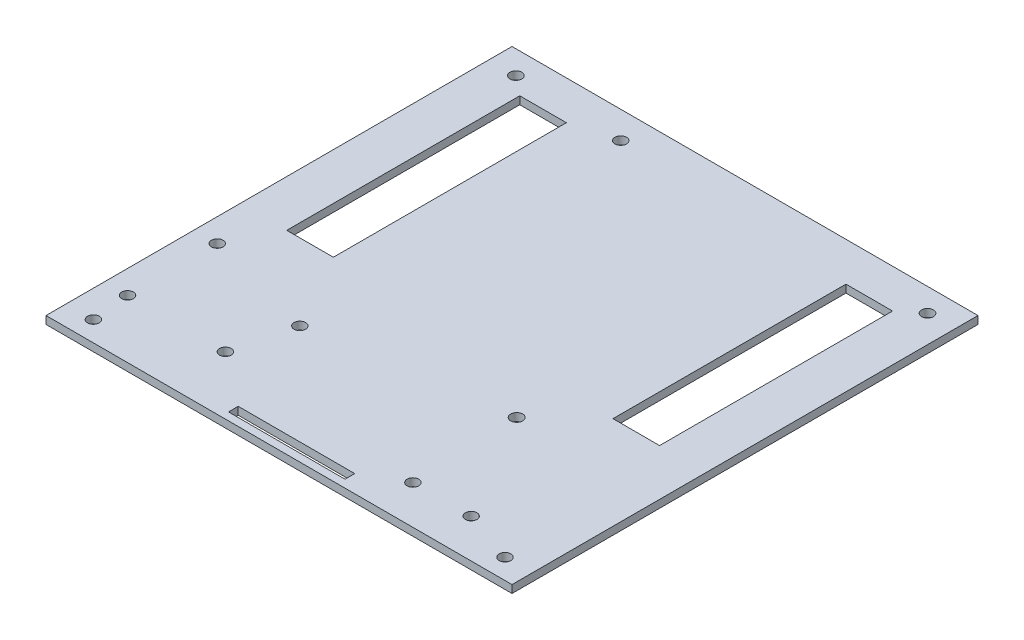
ISO-10303-21;
HEADER;
FILE_DESCRIPTION(('STEP AP214'),'2;1');
FILE_NAME('part.step','',(''),(''),'','','');
FILE_SCHEMA(('AUTOMOTIVE_DESIGN { 1 0 10303 214 1 1 1 1 }'));
ENDSEC;
DATA;
#1=APPLICATION_CONTEXT('core data for automotive mechanical design processes');
#2=APPLICATION_PROTOCOL_DEFINITION('international standard','automotive_design',2000,#1);
#3=PRODUCT_CONTEXT('',#1,'mechanical');
#4=PRODUCT('Part','Part','',(#3));
#5=PRODUCT_RELATED_PRODUCT_CATEGORY('part','',(#4));
#6=PRODUCT_DEFINITION_FORMATION('','',#4);
#7=PRODUCT_DEFINITION_CONTEXT('part definition',#1,'design');
#8=PRODUCT_DEFINITION('design','',#6,#7);
#9=PRODUCT_DEFINITION_SHAPE('','',#8);
#10=(LENGTH_UNIT() NAMED_UNIT(*) SI_UNIT(.MILLI.,.METRE.));
#11=(NAMED_UNIT(*) PLANE_ANGLE_UNIT() SI_UNIT($,.RADIAN.));
#12=(NAMED_UNIT(*) SI_UNIT($,.STERADIAN.) SOLID_ANGLE_UNIT());
#13=UNCERTAINTY_MEASURE_WITH_UNIT(LENGTH_MEASURE(1.E-05),#10,'distance_accuracy_value','');
#14=(GEOMETRIC_REPRESENTATION_CONTEXT(3) GLOBAL_UNCERTAINTY_ASSIGNED_CONTEXT((#13)) GLOBAL_UNIT_ASSIGNED_CONTEXT((#10,
#11,#12)) REPRESENTATION_CONTEXT('',''));
#15=CARTESIAN_POINT('',(0.,0.,0.));
#16=DIRECTION('',(0.,0.,1.));
#17=DIRECTION('',(1.,0.,0.));
#18=AXIS2_PLACEMENT_3D('',#15,#16,#17);
#19=CARTESIAN_POINT('',(-60.,2.,60.));
#20=DIRECTION('',(1.,0.,0.));
#21=DIRECTION('',(0.,0.,-1.));
#22=AXIS2_PLACEMENT_3D('',#19,#20,#21);
#23=PLANE('',#22);
#24=DIRECTION('',(0.,0.,1.));
#25=VECTOR('',#24,1.);
#26=CARTESIAN_POINT('',(-60.,0.,60.));
#27=LINE('',#26,#25);
#28=CARTESIAN_POINT('',(-60.,0.,-60.));
#29=VERTEX_POINT('',#28);
#30=CARTESIAN_POINT('',(-60.,0.,60.));
#31=VERTEX_POINT('',#30);
#32=EDGE_CURVE('E309',#29,#31,#27,.T.);
#33=ORIENTED_EDGE('',*,*,#32,.T.);
#34=DIRECTION('',(0.,-1.,0.));
#35=VECTOR('',#34,1.);
#36=CARTESIAN_POINT('',(-60.,2.,60.));
#37=LINE('',#36,#35);
#38=CARTESIAN_POINT('',(-60.,2.,60.));
#39=VERTEX_POINT('',#38);
#40=EDGE_CURVE('E11',#39,#31,#37,.T.);
#41=ORIENTED_EDGE('',*,*,#40,.F.);
#42=DIRECTION('',(0.,0.,1.));
#43=VECTOR('',#42,1.);
#44=CARTESIAN_POINT('',(-60.,2.,60.));
#45=LINE('',#44,#43);
#46=CARTESIAN_POINT('',(-60.,2.,-60.));
#47=VERTEX_POINT('',#46);
#48=EDGE_CURVE('E312',#47,#39,#45,.T.);
#49=ORIENTED_EDGE('',*,*,#48,.F.);
#50=DIRECTION('',(0.,-1.,0.));
#51=VECTOR('',#50,1.);
#52=CARTESIAN_POINT('',(-60.,2.,-60.));
#53=LINE('',#52,#51);
#54=EDGE_CURVE('E322',#47,#29,#53,.T.);
#55=ORIENTED_EDGE('',*,*,#54,.T.);
#56=EDGE_LOOP('',(#33,#41,#49,#55));
#57=FACE_BOUND('',#56,.T.);
#58=ADVANCED_FACE('F35',(#57),#23,.F.);
#59=CARTESIAN_POINT('',(60.,2.,60.));
#60=DIRECTION('',(0.,0.,-1.));
#61=DIRECTION('',(-1.,0.,0.));
#62=AXIS2_PLACEMENT_3D('',#59,#60,#61);
#63=PLANE('',#62);
#64=DIRECTION('',(1.,0.,0.));
#65=VECTOR('',#64,1.);
#66=CARTESIAN_POINT('',(60.,0.,60.));
#67=LINE('',#66,#65);
#68=CARTESIAN_POINT('',(60.,0.,60.));
#69=VERTEX_POINT('',#68);
#70=EDGE_CURVE('E325',#31,#69,#67,.T.);
#71=ORIENTED_EDGE('',*,*,#70,.T.);
#72=DIRECTION('',(0.,-1.,0.));
#73=VECTOR('',#72,1.);
#74=CARTESIAN_POINT('',(60.,2.,60.));
#75=LINE('',#74,#73);
#76=CARTESIAN_POINT('',(60.,2.,60.));
#77=VERTEX_POINT('',#76);
#78=EDGE_CURVE('E42',#77,#69,#75,.T.);
#79=ORIENTED_EDGE('',*,*,#78,.F.);
#80=DIRECTION('',(1.,0.,0.));
#81=VECTOR('',#80,1.);
#82=CARTESIAN_POINT('',(60.,2.,60.));
#83=LINE('',#82,#81);
#84=EDGE_CURVE('E315',#39,#77,#83,.T.);
#85=ORIENTED_EDGE('',*,*,#84,.F.);
#86=ORIENTED_EDGE('',*,*,#40,.T.);
#87=EDGE_LOOP('',(#71,#79,#85,#86));
#88=FACE_BOUND('',#87,.T.);
#89=ADVANCED_FACE('F354',(#88),#63,.F.);
#90=CARTESIAN_POINT('',(60.,2.,60.));
#91=DIRECTION('',(-1.,0.,0.));
#92=DIRECTION('',(0.,0.,1.));
#93=AXIS2_PLACEMENT_3D('',#90,#91,#92);
#94=PLANE('',#93);
#95=DIRECTION('',(0.,0.,-1.));
#96=VECTOR('',#95,1.);
#97=CARTESIAN_POINT('',(60.,0.,60.));
#98=LINE('',#97,#96);
#99=CARTESIAN_POINT('',(60.,0.,-60.));
#100=VERTEX_POINT('',#99);
#101=EDGE_CURVE('E327',#69,#100,#98,.T.);
#102=ORIENTED_EDGE('',*,*,#101,.T.);
#103=DIRECTION('',(0.,-1.,0.));
#104=VECTOR('',#103,1.);
#105=CARTESIAN_POINT('',(60.,2.,-60.));
#106=LINE('',#105,#104);
#107=CARTESIAN_POINT('',(60.,2.,-60.));
#108=VERTEX_POINT('',#107);
#109=EDGE_CURVE('E332',#108,#100,#106,.T.);
#110=ORIENTED_EDGE('',*,*,#109,.F.);
#111=DIRECTION('',(0.,0.,-1.));
#112=VECTOR('',#111,1.);
#113=CARTESIAN_POINT('',(60.,2.,60.));
#114=LINE('',#113,#112);
#115=EDGE_CURVE('E318',#77,#108,#114,.T.);
#116=ORIENTED_EDGE('',*,*,#115,.F.);
#117=ORIENTED_EDGE('',*,*,#78,.T.);
#118=EDGE_LOOP('',(#102,#110,#116,#117));
#119=FACE_BOUND('',#118,.T.);
#120=ADVANCED_FACE('F339',(#119),#94,.F.);
#121=CARTESIAN_POINT('',(60.,2.,-60.));
#122=DIRECTION('',(0.,0.,1.));
#123=DIRECTION('',(1.,0.,0.));
#124=AXIS2_PLACEMENT_3D('',#121,#122,#123);
#125=PLANE('',#124);
#126=DIRECTION('',(-1.,0.,0.));
#127=VECTOR('',#126,1.);
#128=CARTESIAN_POINT('',(60.,0.,-60.));
#129=LINE('',#128,#127);
#130=EDGE_CURVE('E316',#100,#29,#129,.T.);
#131=ORIENTED_EDGE('',*,*,#130,.T.);
#132=ORIENTED_EDGE('',*,*,#54,.F.);
#133=DIRECTION('',(-1.,0.,0.));
#134=VECTOR('',#133,1.);
#135=CARTESIAN_POINT('',(60.,2.,-60.));
#136=LINE('',#135,#134);
#137=EDGE_CURVE('E320',#108,#47,#136,.T.);
#138=ORIENTED_EDGE('',*,*,#137,.F.);
#139=ORIENTED_EDGE('',*,*,#109,.T.);
#140=EDGE_LOOP('',(#131,#132,#138,#139));
#141=FACE_BOUND('',#140,.T.);
#142=ADVANCED_FACE('F347',(#141),#125,.F.);
#143=CARTESIAN_POINT('',(0.,2.,0.));
#144=DIRECTION('',(0.,1.,0.));
#145=DIRECTION('',(0.,0.,1.));
#146=AXIS2_PLACEMENT_3D('',#143,#144,#145);
#147=PLANE('',#146);
#148=CARTESIAN_POINT('',(39.4795870915248,2.,50.));
#149=DIRECTION('',(0.,1.,0.));
#150=DIRECTION('',(0.,0.,1.));
#151=AXIS2_PLACEMENT_3D('',#148,#149,#150);
#152=CIRCLE('',#151,1.5);
#153=CARTESIAN_POINT('',(39.4795870915248,2.,51.5));
#154=VERTEX_POINT('',#153);
#155=EDGE_CURVE('E468',#154,#154,#152,.T.);
#156=ORIENTED_EDGE('',*,*,#155,.F.);
#157=EDGE_LOOP('',(#156));
#158=FACE_BOUND('',#157,.T.);
#159=CARTESIAN_POINT('',(24.4795870915248,2.,50.));
#160=DIRECTION('',(0.,1.,0.));
#161=DIRECTION('',(0.,0.,1.));
#162=AXIS2_PLACEMENT_3D('',#159,#160,#161);
#163=CIRCLE('',#162,1.5);
#164=CARTESIAN_POINT('',(24.4795870915248,2.,51.5));
#165=VERTEX_POINT('',#164);
#166=EDGE_CURVE('E171',#165,#165,#163,.T.);
#167=ORIENTED_EDGE('',*,*,#166,.F.);
#168=EDGE_LOOP('',(#167));
#169=FACE_BOUND('',#168,.T.);
#170=DIRECTION('',(0.,0.,1.));
#171=VECTOR('',#170,1.);
#172=CARTESIAN_POINT('',(-15.,2.,58.));
#173=LINE('',#172,#171);
#174=CARTESIAN_POINT('',(-15.,2.,55.5));
#175=VERTEX_POINT('',#174);
#176=CARTESIAN_POINT('',(-15.,2.,58.));
#177=VERTEX_POINT('',#176);
#178=EDGE_CURVE('E49',#175,#177,#173,.T.);
#179=ORIENTED_EDGE('',*,*,#178,.F.);
#180=DIRECTION('',(-1.,0.,0.));
#181=VECTOR('',#180,1.);
#182=CARTESIAN_POINT('',(15.,2.,55.5));
#183=LINE('',#182,#181);
#184=CARTESIAN_POINT('',(15.,2.,55.5));
#185=VERTEX_POINT('',#184);
#186=EDGE_CURVE('E165',#185,#175,#183,.T.);
#187=ORIENTED_EDGE('',*,*,#186,.F.);
#188=DIRECTION('',(0.,0.,-1.));
#189=VECTOR('',#188,1.);
#190=CARTESIAN_POINT('',(15.,2.,58.));
#191=LINE('',#190,#189);
#192=CARTESIAN_POINT('',(15.,2.,58.));
#193=VERTEX_POINT('',#192);
#194=EDGE_CURVE('E168',#193,#185,#191,.T.);
#195=ORIENTED_EDGE('',*,*,#194,.F.);
#196=DIRECTION('',(1.,0.,0.));
#197=VECTOR('',#196,1.);
#198=CARTESIAN_POINT('',(15.,2.,58.));
#199=LINE('',#198,#197);
#200=EDGE_CURVE('E177',#177,#193,#199,.T.);
#201=ORIENTED_EDGE('',*,*,#200,.F.);
#202=EDGE_LOOP('',(#179,#187,#195,#201));
#203=FACE_BOUND('',#202,.T.);
#204=CARTESIAN_POINT('',(-54.,2.,21.9));
#205=DIRECTION('',(0.,1.,0.));
#206=DIRECTION('',(0.,0.,1.));
#207=AXIS2_PLACEMENT_3D('',#204,#205,#206);
#208=CIRCLE('',#207,1.5);
#209=CARTESIAN_POINT('',(-54.,2.,23.4));
#210=VERTEX_POINT('',#209);
#211=EDGE_CURVE('E184',#210,#210,#208,.T.);
#212=ORIENTED_EDGE('',*,*,#211,.F.);
#213=EDGE_LOOP('',(#212));
#214=FACE_BOUND('',#213,.T.);
#215=CARTESIAN_POINT('',(-28.82,2.,45.));
#216=DIRECTION('',(0.,1.,0.));
#217=DIRECTION('',(0.,0.,1.));
#218=AXIS2_PLACEMENT_3D('',#215,#216,#217);
#219=CIRCLE('',#218,1.5);
#220=CARTESIAN_POINT('',(-28.82,2.,46.5));
#221=VERTEX_POINT('',#220);
#222=EDGE_CURVE('E191',#221,#221,#219,.T.);
#223=ORIENTED_EDGE('',*,*,#222,.F.);
#224=EDGE_LOOP('',(#223));
#225=FACE_BOUND('',#224,.T.);
#226=CARTESIAN_POINT('',(-54.,2.,45.));
#227=DIRECTION('',(0.,1.,0.));
#228=DIRECTION('',(0.,0.,1.));
#229=AXIS2_PLACEMENT_3D('',#226,#227,#228);
#230=CIRCLE('',#229,1.5);
#231=CARTESIAN_POINT('',(-54.,2.,46.5));
#232=VERTEX_POINT('',#231);
#233=EDGE_CURVE('E197',#232,#232,#230,.T.);
#234=ORIENTED_EDGE('',*,*,#233,.F.);
#235=EDGE_LOOP('',(#234));
#236=FACE_BOUND('',#235,.T.);
#237=DIRECTION('',(0.,0.,1.));
#238=VECTOR('',#237,1.);
#239=CARTESIAN_POINT('',(36.,2.,-50.));
#240=LINE('',#239,#238);
#241=CARTESIAN_POINT('',(36.,2.,-50.));
#242=VERTEX_POINT('',#241);
#243=CARTESIAN_POINT('',(36.,2.,10.));
#244=VERTEX_POINT('',#243);
#245=EDGE_CURVE('E203',#242,#244,#240,.T.);
#246=ORIENTED_EDGE('',*,*,#245,.F.);
#247=DIRECTION('',(-1.,0.,0.));
#248=VECTOR('',#247,1.);
#249=CARTESIAN_POINT('',(36.,2.,-50.));
#250=LINE('',#249,#248);
#251=CARTESIAN_POINT('',(48.,2.,-50.));
#252=VERTEX_POINT('',#251);
#253=EDGE_CURVE('E210',#252,#242,#250,.T.);
#254=ORIENTED_EDGE('',*,*,#253,.F.);
#255=DIRECTION('',(0.,0.,-1.));
#256=VECTOR('',#255,1.);
#257=CARTESIAN_POINT('',(48.,2.,-50.));
#258=LINE('',#257,#256);
#259=CARTESIAN_POINT('',(48.,2.,10.));
#260=VERTEX_POINT('',#259);
#261=EDGE_CURVE('E224',#260,#252,#258,.T.);
#262=ORIENTED_EDGE('',*,*,#261,.F.);
#263=DIRECTION('',(1.,0.,0.));
#264=VECTOR('',#263,1.);
#265=CARTESIAN_POINT('',(36.,2.,10.));
#266=LINE('',#265,#264);
#267=EDGE_CURVE('E221',#244,#260,#266,.T.);
#268=ORIENTED_EDGE('',*,*,#267,.F.);
#269=EDGE_LOOP('',(#246,#254,#262,#268));
#270=FACE_BOUND('',#269,.T.);
#271=DIRECTION('',(0.,0.,1.));
#272=VECTOR('',#271,1.);
#273=CARTESIAN_POINT('',(-48.,2.,-50.));
#274=LINE('',#273,#272);
#275=CARTESIAN_POINT('',(-48.,2.,-50.));
#276=VERTEX_POINT('',#275);
#277=CARTESIAN_POINT('',(-48.,2.,10.));
#278=VERTEX_POINT('',#277);
#279=EDGE_CURVE('E231',#276,#278,#274,.T.);
#280=ORIENTED_EDGE('',*,*,#279,.F.);
#281=DIRECTION('',(-1.,0.,0.));
#282=VECTOR('',#281,1.);
#283=CARTESIAN_POINT('',(-36.,2.,-50.));
#284=LINE('',#283,#282);
#285=CARTESIAN_POINT('',(-36.,2.,-50.));
#286=VERTEX_POINT('',#285);
#287=EDGE_CURVE('E242',#286,#276,#284,.T.);
#288=ORIENTED_EDGE('',*,*,#287,.F.);
#289=DIRECTION('',(0.,0.,-1.));
#290=VECTOR('',#289,1.);
#291=CARTESIAN_POINT('',(-36.,2.,-50.));
#292=LINE('',#291,#290);
#293=CARTESIAN_POINT('',(-36.,2.,10.));
#294=VERTEX_POINT('',#293);
#295=EDGE_CURVE('E256',#294,#286,#292,.T.);
#296=ORIENTED_EDGE('',*,*,#295,.F.);
#297=DIRECTION('',(1.,0.,0.));
#298=VECTOR('',#297,1.);
#299=CARTESIAN_POINT('',(-36.,2.,10.));
#300=LINE('',#299,#298);
#301=EDGE_CURVE('E253',#278,#294,#300,.T.);
#302=ORIENTED_EDGE('',*,*,#301,.F.);
#303=EDGE_LOOP('',(#280,#288,#296,#302));
#304=FACE_BOUND('',#303,.T.);
#305=CARTESIAN_POINT('',(23.34,2.,22.13));
#306=DIRECTION('',(0.,1.,0.));
#307=DIRECTION('',(0.,0.,1.));
#308=AXIS2_PLACEMENT_3D('',#305,#306,#307);
#309=CIRCLE('',#308,1.55);
#310=CARTESIAN_POINT('',(23.34,2.,23.68));
#311=VERTEX_POINT('',#310);
#312=EDGE_CURVE('E263',#311,#311,#309,.T.);
#313=ORIENTED_EDGE('',*,*,#312,.F.);
#314=EDGE_LOOP('',(#313));
#315=FACE_BOUND('',#314,.T.);
#316=CARTESIAN_POINT('',(-25.,2.,29.63));
#317=DIRECTION('',(0.,1.,0.));
#318=DIRECTION('',(0.,0.,1.));
#319=AXIS2_PLACEMENT_3D('',#316,#317,#318);
#320=CIRCLE('',#319,1.5);
#321=CARTESIAN_POINT('',(-25.,2.,31.13));
#322=VERTEX_POINT('',#321);
#323=EDGE_CURVE('E273',#322,#322,#320,.T.);
#324=ORIENTED_EDGE('',*,*,#323,.F.);
#325=EDGE_LOOP('',(#324));
#326=FACE_BOUND('',#325,.T.);
#327=CARTESIAN_POINT('',(-25.,2.,-53.));
#328=DIRECTION('',(0.,1.,0.));
#329=DIRECTION('',(0.,0.,1.));
#330=AXIS2_PLACEMENT_3D('',#327,#328,#329);
#331=CIRCLE('',#330,1.5);
#332=CARTESIAN_POINT('',(-25.,2.,-51.5));
#333=VERTEX_POINT('',#332);
#334=EDGE_CURVE('E279',#333,#333,#331,.T.);
#335=ORIENTED_EDGE('',*,*,#334,.F.);
#336=EDGE_LOOP('',(#335));
#337=FACE_BOUND('',#336,.T.);
#338=CARTESIAN_POINT('',(53.,2.,54.8));
#339=DIRECTION('',(0.,1.,0.));
#340=DIRECTION('',(0.,0.,-1.));
#341=AXIS2_PLACEMENT_3D('',#338,#339,#340);
#342=CIRCLE('',#341,1.5);
#343=CARTESIAN_POINT('',(53.,2.,53.3));
#344=VERTEX_POINT('',#343);
#345=EDGE_CURVE('E285',#344,#344,#342,.T.);
#346=ORIENTED_EDGE('',*,*,#345,.F.);
#347=EDGE_LOOP('',(#346));
#348=FACE_BOUND('',#347,.T.);
#349=CARTESIAN_POINT('',(53.,2.,-54.));
#350=DIRECTION('',(0.,1.,0.));
#351=DIRECTION('',(0.,0.,-1.));
#352=AXIS2_PLACEMENT_3D('',#349,#350,#351);
#353=CIRCLE('',#352,1.525);
#354=CARTESIAN_POINT('',(53.,2.,-55.525));
#355=VERTEX_POINT('',#354);
#356=EDGE_CURVE('E291',#355,#355,#353,.T.);
#357=ORIENTED_EDGE('',*,*,#356,.F.);
#358=EDGE_LOOP('',(#357));
#359=FACE_BOUND('',#358,.T.);
#360=CARTESIAN_POINT('',(-53.,2.,54.8));
#361=DIRECTION('',(0.,1.,0.));
#362=DIRECTION('',(0.,0.,1.));
#363=AXIS2_PLACEMENT_3D('',#360,#361,#362);
#364=CIRCLE('',#363,1.5);
#365=CARTESIAN_POINT('',(-53.,2.,56.3));
#366=VERTEX_POINT('',#365);
#367=EDGE_CURVE('E297',#366,#366,#364,.T.);
#368=ORIENTED_EDGE('',*,*,#367,.F.);
#369=EDGE_LOOP('',(#368));
#370=FACE_BOUND('',#369,.T.);
#371=CARTESIAN_POINT('',(-53.,2.,-54.));
#372=DIRECTION('',(0.,1.,0.));
#373=DIRECTION('',(0.,0.,1.));
#374=AXIS2_PLACEMENT_3D('',#371,#372,#373);
#375=CIRCLE('',#374,1.525);
#376=CARTESIAN_POINT('',(-53.,2.,-52.475));
#377=VERTEX_POINT('',#376);
#378=EDGE_CURVE('E303',#377,#377,#375,.T.);
#379=ORIENTED_EDGE('',*,*,#378,.F.);
#380=EDGE_LOOP('',(#379));
#381=FACE_BOUND('',#380,.T.);
#382=ORIENTED_EDGE('',*,*,#48,.T.);
#383=ORIENTED_EDGE('',*,*,#84,.T.);
#384=ORIENTED_EDGE('',*,*,#115,.T.);
#385=ORIENTED_EDGE('',*,*,#137,.T.);
#386=EDGE_LOOP('',(#382,#383,#384,#385));
#387=FACE_BOUND('',#386,.T.);
#388=ADVANCED_FACE('F353',(#158,#169,#203,#214,#225,#236,#270,#304,#315,#326,#337,#348,#359,
#370,#381,#387),#147,.T.);
#389=CARTESIAN_POINT('',(0.,0.,0.));
#390=DIRECTION('',(0.,1.,0.));
#391=DIRECTION('',(0.,0.,1.));
#392=AXIS2_PLACEMENT_3D('',#389,#390,#391);
#393=PLANE('',#392);
#394=CARTESIAN_POINT('',(39.4795870915248,0.,50.));
#395=DIRECTION('',(0.,1.,0.));
#396=DIRECTION('',(0.,0.,1.));
#397=AXIS2_PLACEMENT_3D('',#394,#395,#396);
#398=CIRCLE('',#397,1.5);
#399=CARTESIAN_POINT('',(39.4795870915248,0.,51.5));
#400=VERTEX_POINT('',#399);
#401=EDGE_CURVE('E465',#400,#400,#398,.T.);
#402=ORIENTED_EDGE('',*,*,#401,.T.);
#403=EDGE_LOOP('',(#402));
#404=FACE_BOUND('',#403,.T.);
#405=CARTESIAN_POINT('',(24.4795870915248,0.,50.));
#406=DIRECTION('',(0.,1.,0.));
#407=DIRECTION('',(0.,0.,1.));
#408=AXIS2_PLACEMENT_3D('',#405,#406,#407);
#409=CIRCLE('',#408,1.5);
#410=CARTESIAN_POINT('',(24.4795870915248,0.,51.5));
#411=VERTEX_POINT('',#410);
#412=EDGE_CURVE('E178',#411,#411,#409,.T.);
#413=ORIENTED_EDGE('',*,*,#412,.T.);
#414=EDGE_LOOP('',(#413));
#415=FACE_BOUND('',#414,.T.);
#416=DIRECTION('',(-1.,0.,0.));
#417=VECTOR('',#416,1.);
#418=CARTESIAN_POINT('',(15.,0.,55.5));
#419=LINE('',#418,#417);
#420=CARTESIAN_POINT('',(15.,0.,55.5));
#421=VERTEX_POINT('',#420);
#422=CARTESIAN_POINT('',(-15.,0.,55.5));
#423=VERTEX_POINT('',#422);
#424=EDGE_CURVE('E155',#421,#423,#419,.T.);
#425=ORIENTED_EDGE('',*,*,#424,.T.);
#426=DIRECTION('',(0.,0.,1.));
#427=VECTOR('',#426,1.);
#428=CARTESIAN_POINT('',(-15.,0.,58.));
#429=LINE('',#428,#427);
#430=CARTESIAN_POINT('',(-15.,0.,58.));
#431=VERTEX_POINT('',#430);
#432=EDGE_CURVE('E149',#423,#431,#429,.T.);
#433=ORIENTED_EDGE('',*,*,#432,.T.);
#434=DIRECTION('',(1.,0.,0.));
#435=VECTOR('',#434,1.);
#436=CARTESIAN_POINT('',(15.,0.,58.));
#437=LINE('',#436,#435);
#438=CARTESIAN_POINT('',(15.,0.,58.));
#439=VERTEX_POINT('',#438);
#440=EDGE_CURVE('E158',#431,#439,#437,.T.);
#441=ORIENTED_EDGE('',*,*,#440,.T.);
#442=DIRECTION('',(0.,0.,-1.));
#443=VECTOR('',#442,1.);
#444=CARTESIAN_POINT('',(15.,0.,58.));
#445=LINE('',#444,#443);
#446=EDGE_CURVE('E57',#439,#421,#445,.T.);
#447=ORIENTED_EDGE('',*,*,#446,.T.);
#448=EDGE_LOOP('',(#425,#433,#441,#447));
#449=FACE_BOUND('',#448,.T.);
#450=CARTESIAN_POINT('',(-54.,0.,21.9));
#451=DIRECTION('',(0.,1.,0.));
#452=DIRECTION('',(0.,0.,1.));
#453=AXIS2_PLACEMENT_3D('',#450,#451,#452);
#454=CIRCLE('',#453,1.5);
#455=CARTESIAN_POINT('',(-54.,0.,23.4));
#456=VERTEX_POINT('',#455);
#457=EDGE_CURVE('E188',#456,#456,#454,.T.);
#458=ORIENTED_EDGE('',*,*,#457,.T.);
#459=EDGE_LOOP('',(#458));
#460=FACE_BOUND('',#459,.T.);
#461=CARTESIAN_POINT('',(-28.82,0.,45.));
#462=DIRECTION('',(0.,1.,0.));
#463=DIRECTION('',(0.,0.,1.));
#464=AXIS2_PLACEMENT_3D('',#461,#462,#463);
#465=CIRCLE('',#464,1.5);
#466=CARTESIAN_POINT('',(-28.82,0.,46.5));
#467=VERTEX_POINT('',#466);
#468=EDGE_CURVE('E194',#467,#467,#465,.T.);
#469=ORIENTED_EDGE('',*,*,#468,.T.);
#470=EDGE_LOOP('',(#469));
#471=FACE_BOUND('',#470,.T.);
#472=CARTESIAN_POINT('',(-54.,0.,45.));
#473=DIRECTION('',(0.,1.,0.));
#474=DIRECTION('',(0.,0.,1.));
#475=AXIS2_PLACEMENT_3D('',#472,#473,#474);
#476=CIRCLE('',#475,1.5);
#477=CARTESIAN_POINT('',(-54.,0.,46.5));
#478=VERTEX_POINT('',#477);
#479=EDGE_CURVE('E200',#478,#478,#476,.T.);
#480=ORIENTED_EDGE('',*,*,#479,.T.);
#481=EDGE_LOOP('',(#480));
#482=FACE_BOUND('',#481,.T.);
#483=DIRECTION('',(-1.,0.,0.));
#484=VECTOR('',#483,1.);
#485=CARTESIAN_POINT('',(36.,0.,-50.));
#486=LINE('',#485,#484);
#487=CARTESIAN_POINT('',(48.,0.,-50.));
#488=VERTEX_POINT('',#487);
#489=CARTESIAN_POINT('',(36.,0.,-50.));
#490=VERTEX_POINT('',#489);
#491=EDGE_CURVE('E216',#488,#490,#486,.T.);
#492=ORIENTED_EDGE('',*,*,#491,.T.);
#493=DIRECTION('',(0.,0.,1.));
#494=VECTOR('',#493,1.);
#495=CARTESIAN_POINT('',(36.,0.,-50.));
#496=LINE('',#495,#494);
#497=CARTESIAN_POINT('',(36.,0.,10.));
#498=VERTEX_POINT('',#497);
#499=EDGE_CURVE('E206',#490,#498,#496,.T.);
#500=ORIENTED_EDGE('',*,*,#499,.T.);
#501=DIRECTION('',(1.,0.,0.));
#502=VECTOR('',#501,1.);
#503=CARTESIAN_POINT('',(36.,0.,10.));
#504=LINE('',#503,#502);
#505=CARTESIAN_POINT('',(48.,0.,10.));
#506=VERTEX_POINT('',#505);
#507=EDGE_CURVE('E209',#498,#506,#504,.T.);
#508=ORIENTED_EDGE('',*,*,#507,.T.);
#509=DIRECTION('',(0.,0.,-1.));
#510=VECTOR('',#509,1.);
#511=CARTESIAN_POINT('',(48.,0.,-50.));
#512=LINE('',#511,#510);
#513=EDGE_CURVE('E213',#506,#488,#512,.T.);
#514=ORIENTED_EDGE('',*,*,#513,.T.);
#515=EDGE_LOOP('',(#492,#500,#508,#514));
#516=FACE_BOUND('',#515,.T.);
#517=DIRECTION('',(-1.,0.,0.));
#518=VECTOR('',#517,1.);
#519=CARTESIAN_POINT('',(-36.,0.,-50.));
#520=LINE('',#519,#518);
#521=CARTESIAN_POINT('',(-36.,0.,-50.));
#522=VERTEX_POINT('',#521);
#523=CARTESIAN_POINT('',(-48.,0.,-50.));
#524=VERTEX_POINT('',#523);
#525=EDGE_CURVE('E248',#522,#524,#520,.T.);
#526=ORIENTED_EDGE('',*,*,#525,.T.);
#527=DIRECTION('',(0.,0.,1.));
#528=VECTOR('',#527,1.);
#529=CARTESIAN_POINT('',(-48.,0.,-50.));
#530=LINE('',#529,#528);
#531=CARTESIAN_POINT('',(-48.,0.,10.));
#532=VERTEX_POINT('',#531);
#533=EDGE_CURVE('E238',#524,#532,#530,.T.);
#534=ORIENTED_EDGE('',*,*,#533,.T.);
#535=DIRECTION('',(1.,0.,0.));
#536=VECTOR('',#535,1.);
#537=CARTESIAN_POINT('',(-36.,0.,10.));
#538=LINE('',#537,#536);
#539=CARTESIAN_POINT('',(-36.,0.,10.));
#540=VERTEX_POINT('',#539);
#541=EDGE_CURVE('E241',#532,#540,#538,.T.);
#542=ORIENTED_EDGE('',*,*,#541,.T.);
#543=DIRECTION('',(0.,0.,-1.));
#544=VECTOR('',#543,1.);
#545=CARTESIAN_POINT('',(-36.,0.,-50.));
#546=LINE('',#545,#544);
#547=EDGE_CURVE('E245',#540,#522,#546,.T.);
#548=ORIENTED_EDGE('',*,*,#547,.T.);
#549=EDGE_LOOP('',(#526,#534,#542,#548));
#550=FACE_BOUND('',#549,.T.);
#551=CARTESIAN_POINT('',(23.34,0.,22.13));
#552=DIRECTION('',(0.,1.,0.));
#553=DIRECTION('',(0.,0.,1.));
#554=AXIS2_PLACEMENT_3D('',#551,#552,#553);
#555=CIRCLE('',#554,1.55);
#556=CARTESIAN_POINT('',(23.34,0.,23.68));
#557=VERTEX_POINT('',#556);
#558=EDGE_CURVE('E270',#557,#557,#555,.T.);
#559=ORIENTED_EDGE('',*,*,#558,.T.);
#560=EDGE_LOOP('',(#559));
#561=FACE_BOUND('',#560,.T.);
#562=CARTESIAN_POINT('',(-25.,0.,29.63));
#563=DIRECTION('',(0.,1.,0.));
#564=DIRECTION('',(0.,0.,1.));
#565=AXIS2_PLACEMENT_3D('',#562,#563,#564);
#566=CIRCLE('',#565,1.5);
#567=CARTESIAN_POINT('',(-25.,0.,31.13));
#568=VERTEX_POINT('',#567);
#569=EDGE_CURVE('E276',#568,#568,#566,.T.);
#570=ORIENTED_EDGE('',*,*,#569,.T.);
#571=EDGE_LOOP('',(#570));
#572=FACE_BOUND('',#571,.T.);
#573=CARTESIAN_POINT('',(-25.,0.,-53.));
#574=DIRECTION('',(0.,1.,0.));
#575=DIRECTION('',(0.,0.,1.));
#576=AXIS2_PLACEMENT_3D('',#573,#574,#575);
#577=CIRCLE('',#576,1.5);
#578=CARTESIAN_POINT('',(-25.,0.,-51.5));
#579=VERTEX_POINT('',#578);
#580=EDGE_CURVE('E282',#579,#579,#577,.T.);
#581=ORIENTED_EDGE('',*,*,#580,.T.);
#582=EDGE_LOOP('',(#581));
#583=FACE_BOUND('',#582,.T.);
#584=CARTESIAN_POINT('',(53.,0.,54.8));
#585=DIRECTION('',(0.,1.,0.));
#586=DIRECTION('',(0.,0.,-1.));
#587=AXIS2_PLACEMENT_3D('',#584,#585,#586);
#588=CIRCLE('',#587,1.5);
#589=CARTESIAN_POINT('',(53.,0.,53.3));
#590=VERTEX_POINT('',#589);
#591=EDGE_CURVE('E288',#590,#590,#588,.T.);
#592=ORIENTED_EDGE('',*,*,#591,.T.);
#593=EDGE_LOOP('',(#592));
#594=FACE_BOUND('',#593,.T.);
#595=CARTESIAN_POINT('',(53.,0.,-54.));
#596=DIRECTION('',(0.,1.,0.));
#597=DIRECTION('',(0.,0.,-1.));
#598=AXIS2_PLACEMENT_3D('',#595,#596,#597);
#599=CIRCLE('',#598,1.525);
#600=CARTESIAN_POINT('',(53.,0.,-55.525));
#601=VERTEX_POINT('',#600);
#602=EDGE_CURVE('E294',#601,#601,#599,.T.);
#603=ORIENTED_EDGE('',*,*,#602,.T.);
#604=EDGE_LOOP('',(#603));
#605=FACE_BOUND('',#604,.T.);
#606=CARTESIAN_POINT('',(-53.,0.,54.8));
#607=DIRECTION('',(0.,1.,0.));
#608=DIRECTION('',(0.,0.,1.));
#609=AXIS2_PLACEMENT_3D('',#606,#607,#608);
#610=CIRCLE('',#609,1.5);
#611=CARTESIAN_POINT('',(-53.,0.,56.3));
#612=VERTEX_POINT('',#611);
#613=EDGE_CURVE('E300',#612,#612,#610,.T.);
#614=ORIENTED_EDGE('',*,*,#613,.T.);
#615=EDGE_LOOP('',(#614));
#616=FACE_BOUND('',#615,.T.);
#617=CARTESIAN_POINT('',(-53.,0.,-54.));
#618=DIRECTION('',(0.,1.,0.));
#619=DIRECTION('',(0.,0.,1.));
#620=AXIS2_PLACEMENT_3D('',#617,#618,#619);
#621=CIRCLE('',#620,1.525);
#622=CARTESIAN_POINT('',(-53.,0.,-52.475));
#623=VERTEX_POINT('',#622);
#624=EDGE_CURVE('E306',#623,#623,#621,.T.);
#625=ORIENTED_EDGE('',*,*,#624,.T.);
#626=EDGE_LOOP('',(#625));
#627=FACE_BOUND('',#626,.T.);
#628=ORIENTED_EDGE('',*,*,#32,.F.);
#629=ORIENTED_EDGE('',*,*,#130,.F.);
#630=ORIENTED_EDGE('',*,*,#101,.F.);
#631=ORIENTED_EDGE('',*,*,#70,.F.);
#632=EDGE_LOOP('',(#628,#629,#630,#631));
#633=FACE_BOUND('',#632,.T.);
#634=ADVANCED_FACE('F162',(#404,#415,#449,#460,#471,#482,#516,#550,#561,#572,#583,#594,#605,
#616,#627,#633),#393,.F.);
#635=CARTESIAN_POINT('',(-53.,0.,-54.));
#636=DIRECTION('',(0.,1.,0.));
#637=DIRECTION('',(0.,0.,1.));
#638=AXIS2_PLACEMENT_3D('',#635,#636,#637);
#639=CYLINDRICAL_SURFACE('',#638,1.525);
#640=ORIENTED_EDGE('',*,*,#624,.F.);
#641=EDGE_LOOP('',(#640));
#642=FACE_BOUND('',#641,.T.);
#643=ORIENTED_EDGE('',*,*,#378,.T.);
#644=EDGE_LOOP('',(#643));
#645=FACE_BOUND('',#644,.T.);
#646=ADVANCED_FACE('F366',(#642,#645),#639,.F.);
#647=CARTESIAN_POINT('',(-53.,0.,54.8));
#648=DIRECTION('',(0.,1.,0.));
#649=DIRECTION('',(0.,0.,1.));
#650=AXIS2_PLACEMENT_3D('',#647,#648,#649);
#651=CYLINDRICAL_SURFACE('',#650,1.5);
#652=ORIENTED_EDGE('',*,*,#613,.F.);
#653=EDGE_LOOP('',(#652));
#654=FACE_BOUND('',#653,.T.);
#655=ORIENTED_EDGE('',*,*,#367,.T.);
#656=EDGE_LOOP('',(#655));
#657=FACE_BOUND('',#656,.T.);
#658=ADVANCED_FACE('F373',(#654,#657),#651,.F.);
#659=CARTESIAN_POINT('',(53.,0.,-54.));
#660=DIRECTION('',(0.,1.,0.));
#661=DIRECTION('',(0.,0.,1.));
#662=AXIS2_PLACEMENT_3D('',#659,#660,#661);
#663=CYLINDRICAL_SURFACE('',#662,1.525);
#664=ORIENTED_EDGE('',*,*,#602,.F.);
#665=EDGE_LOOP('',(#664));
#666=FACE_BOUND('',#665,.T.);
#667=ORIENTED_EDGE('',*,*,#356,.T.);
#668=EDGE_LOOP('',(#667));
#669=FACE_BOUND('',#668,.T.);
#670=ADVANCED_FACE('F377',(#666,#669),#663,.F.);
#671=CARTESIAN_POINT('',(53.,0.,54.8));
#672=DIRECTION('',(0.,1.,0.));
#673=DIRECTION('',(0.,0.,1.));
#674=AXIS2_PLACEMENT_3D('',#671,#672,#673);
#675=CYLINDRICAL_SURFACE('',#674,1.5);
#676=ORIENTED_EDGE('',*,*,#591,.F.);
#677=EDGE_LOOP('',(#676));
#678=FACE_BOUND('',#677,.T.);
#679=ORIENTED_EDGE('',*,*,#345,.T.);
#680=EDGE_LOOP('',(#679));
#681=FACE_BOUND('',#680,.T.);
#682=ADVANCED_FACE('F381',(#678,#681),#675,.F.);
#683=CARTESIAN_POINT('',(-25.,0.,-53.));
#684=DIRECTION('',(0.,1.,0.));
#685=DIRECTION('',(0.,0.,1.));
#686=AXIS2_PLACEMENT_3D('',#683,#684,#685);
#687=CYLINDRICAL_SURFACE('',#686,1.5);
#688=ORIENTED_EDGE('',*,*,#580,.F.);
#689=EDGE_LOOP('',(#688));
#690=FACE_BOUND('',#689,.T.);
#691=ORIENTED_EDGE('',*,*,#334,.T.);
#692=EDGE_LOOP('',(#691));
#693=FACE_BOUND('',#692,.T.);
#694=ADVANCED_FACE('F385',(#690,#693),#687,.F.);
#695=CARTESIAN_POINT('',(-25.,0.,29.63));
#696=DIRECTION('',(0.,1.,0.));
#697=DIRECTION('',(0.,0.,1.));
#698=AXIS2_PLACEMENT_3D('',#695,#696,#697);
#699=CYLINDRICAL_SURFACE('',#698,1.5);
#700=ORIENTED_EDGE('',*,*,#569,.F.);
#701=EDGE_LOOP('',(#700));
#702=FACE_BOUND('',#701,.T.);
#703=ORIENTED_EDGE('',*,*,#323,.T.);
#704=EDGE_LOOP('',(#703));
#705=FACE_BOUND('',#704,.T.);
#706=ADVANCED_FACE('F389',(#702,#705),#699,.F.);
#707=CARTESIAN_POINT('',(23.34,0.,22.13));
#708=DIRECTION('',(0.,1.,0.));
#709=DIRECTION('',(0.,0.,1.));
#710=AXIS2_PLACEMENT_3D('',#707,#708,#709);
#711=CYLINDRICAL_SURFACE('',#710,1.55);
#712=ORIENTED_EDGE('',*,*,#558,.F.);
#713=EDGE_LOOP('',(#712));
#714=FACE_BOUND('',#713,.T.);
#715=ORIENTED_EDGE('',*,*,#312,.T.);
#716=EDGE_LOOP('',(#715));
#717=FACE_BOUND('',#716,.T.);
#718=ADVANCED_FACE('F393',(#714,#717),#711,.F.);
#719=CARTESIAN_POINT('',(-48.,0.,-50.));
#720=DIRECTION('',(-1.,0.,0.));
#721=DIRECTION('',(0.,0.,1.));
#722=AXIS2_PLACEMENT_3D('',#719,#720,#721);
#723=PLANE('',#722);
#724=ORIENTED_EDGE('',*,*,#279,.T.);
#725=DIRECTION('',(0.,1.,0.));
#726=VECTOR('',#725,1.);
#727=CARTESIAN_POINT('',(-48.,0.,10.));
#728=LINE('',#727,#726);
#729=EDGE_CURVE('E251',#532,#278,#728,.T.);
#730=ORIENTED_EDGE('',*,*,#729,.F.);
#731=ORIENTED_EDGE('',*,*,#533,.F.);
#732=DIRECTION('',(0.,1.,0.));
#733=VECTOR('',#732,1.);
#734=CARTESIAN_POINT('',(-48.,0.,-50.));
#735=LINE('',#734,#733);
#736=EDGE_CURVE('E261',#524,#276,#735,.T.);
#737=ORIENTED_EDGE('',*,*,#736,.T.);
#738=EDGE_LOOP('',(#724,#730,#731,#737));
#739=FACE_BOUND('',#738,.T.);
#740=ADVANCED_FACE('F397',(#739),#723,.F.);
#741=CARTESIAN_POINT('',(-36.,0.,-50.));
#742=DIRECTION('',(0.,0.,-1.));
#743=DIRECTION('',(-1.,0.,0.));
#744=AXIS2_PLACEMENT_3D('',#741,#742,#743);
#745=PLANE('',#744);
#746=ORIENTED_EDGE('',*,*,#287,.T.);
#747=ORIENTED_EDGE('',*,*,#736,.F.);
#748=ORIENTED_EDGE('',*,*,#525,.F.);
#749=DIRECTION('',(0.,1.,0.));
#750=VECTOR('',#749,1.);
#751=CARTESIAN_POINT('',(-36.,0.,-50.));
#752=LINE('',#751,#750);
#753=EDGE_CURVE('E264',#522,#286,#752,.T.);
#754=ORIENTED_EDGE('',*,*,#753,.T.);
#755=EDGE_LOOP('',(#746,#747,#748,#754));
#756=FACE_BOUND('',#755,.T.);
#757=ADVANCED_FACE('F401',(#756),#745,.F.);
#758=CARTESIAN_POINT('',(-36.,0.,-50.));
#759=DIRECTION('',(1.,0.,0.));
#760=DIRECTION('',(0.,0.,-1.));
#761=AXIS2_PLACEMENT_3D('',#758,#759,#760);
#762=PLANE('',#761);
#763=ORIENTED_EDGE('',*,*,#295,.T.);
#764=ORIENTED_EDGE('',*,*,#753,.F.);
#765=ORIENTED_EDGE('',*,*,#547,.F.);
#766=DIRECTION('',(0.,1.,0.));
#767=VECTOR('',#766,1.);
#768=CARTESIAN_POINT('',(-36.,0.,10.));
#769=LINE('',#768,#767);
#770=EDGE_CURVE('E266',#540,#294,#769,.T.);
#771=ORIENTED_EDGE('',*,*,#770,.T.);
#772=EDGE_LOOP('',(#763,#764,#765,#771));
#773=FACE_BOUND('',#772,.T.);
#774=ADVANCED_FACE('F407',(#773),#762,.F.);
#775=CARTESIAN_POINT('',(-36.,0.,10.));
#776=DIRECTION('',(0.,0.,1.));
#777=DIRECTION('',(1.,0.,0.));
#778=AXIS2_PLACEMENT_3D('',#775,#776,#777);
#779=PLANE('',#778);
#780=ORIENTED_EDGE('',*,*,#301,.T.);
#781=ORIENTED_EDGE('',*,*,#770,.F.);
#782=ORIENTED_EDGE('',*,*,#541,.F.);
#783=ORIENTED_EDGE('',*,*,#729,.T.);
#784=EDGE_LOOP('',(#780,#781,#782,#783));
#785=FACE_BOUND('',#784,.T.);
#786=ADVANCED_FACE('F403',(#785),#779,.F.);
#787=CARTESIAN_POINT('',(36.,0.,-50.));
#788=DIRECTION('',(-1.,0.,0.));
#789=DIRECTION('',(0.,0.,1.));
#790=AXIS2_PLACEMENT_3D('',#787,#788,#789);
#791=PLANE('',#790);
#792=ORIENTED_EDGE('',*,*,#245,.T.);
#793=DIRECTION('',(0.,1.,0.));
#794=VECTOR('',#793,1.);
#795=CARTESIAN_POINT('',(36.,0.,10.));
#796=LINE('',#795,#794);
#797=EDGE_CURVE('E219',#498,#244,#796,.T.);
#798=ORIENTED_EDGE('',*,*,#797,.F.);
#799=ORIENTED_EDGE('',*,*,#499,.F.);
#800=DIRECTION('',(0.,1.,0.));
#801=VECTOR('',#800,1.);
#802=CARTESIAN_POINT('',(36.,0.,-50.));
#803=LINE('',#802,#801);
#804=EDGE_CURVE('E229',#490,#242,#803,.T.);
#805=ORIENTED_EDGE('',*,*,#804,.T.);
#806=EDGE_LOOP('',(#792,#798,#799,#805));
#807=FACE_BOUND('',#806,.T.);
#808=ADVANCED_FACE('F406',(#807),#791,.F.);
#809=CARTESIAN_POINT('',(36.,0.,-50.));
#810=DIRECTION('',(0.,0.,-1.));
#811=DIRECTION('',(-1.,0.,0.));
#812=AXIS2_PLACEMENT_3D('',#809,#810,#811);
#813=PLANE('',#812);
#814=ORIENTED_EDGE('',*,*,#253,.T.);
#815=ORIENTED_EDGE('',*,*,#804,.F.);
#816=ORIENTED_EDGE('',*,*,#491,.F.);
#817=DIRECTION('',(0.,1.,0.));
#818=VECTOR('',#817,1.);
#819=CARTESIAN_POINT('',(48.,0.,-50.));
#820=LINE('',#819,#818);
#821=EDGE_CURVE('E232',#488,#252,#820,.T.);
#822=ORIENTED_EDGE('',*,*,#821,.T.);
#823=EDGE_LOOP('',(#814,#815,#816,#822));
#824=FACE_BOUND('',#823,.T.);
#825=ADVANCED_FACE('F417',(#824),#813,.F.);
#826=CARTESIAN_POINT('',(48.,0.,-50.));
#827=DIRECTION('',(1.,0.,0.));
#828=DIRECTION('',(0.,0.,-1.));
#829=AXIS2_PLACEMENT_3D('',#826,#827,#828);
#830=PLANE('',#829);
#831=ORIENTED_EDGE('',*,*,#261,.T.);
#832=ORIENTED_EDGE('',*,*,#821,.F.);
#833=ORIENTED_EDGE('',*,*,#513,.F.);
#834=DIRECTION('',(0.,1.,0.));
#835=VECTOR('',#834,1.);
#836=CARTESIAN_POINT('',(48.,0.,10.));
#837=LINE('',#836,#835);
#838=EDGE_CURVE('E234',#506,#260,#837,.T.);
#839=ORIENTED_EDGE('',*,*,#838,.T.);
#840=EDGE_LOOP('',(#831,#832,#833,#839));
#841=FACE_BOUND('',#840,.T.);
#842=ADVANCED_FACE('F423',(#841),#830,.F.);
#843=CARTESIAN_POINT('',(36.,0.,10.));
#844=DIRECTION('',(0.,0.,1.));
#845=DIRECTION('',(1.,0.,0.));
#846=AXIS2_PLACEMENT_3D('',#843,#844,#845);
#847=PLANE('',#846);
#848=ORIENTED_EDGE('',*,*,#267,.T.);
#849=ORIENTED_EDGE('',*,*,#838,.F.);
#850=ORIENTED_EDGE('',*,*,#507,.F.);
#851=ORIENTED_EDGE('',*,*,#797,.T.);
#852=EDGE_LOOP('',(#848,#849,#850,#851));
#853=FACE_BOUND('',#852,.T.);
#854=ADVANCED_FACE('F419',(#853),#847,.F.);
#855=CARTESIAN_POINT('',(-54.,0.,45.));
#856=DIRECTION('',(0.,1.,0.));
#857=DIRECTION('',(0.,0.,1.));
#858=AXIS2_PLACEMENT_3D('',#855,#856,#857);
#859=CYLINDRICAL_SURFACE('',#858,1.5);
#860=ORIENTED_EDGE('',*,*,#479,.F.);
#861=EDGE_LOOP('',(#860));
#862=FACE_BOUND('',#861,.T.);
#863=ORIENTED_EDGE('',*,*,#233,.T.);
#864=EDGE_LOOP('',(#863));
#865=FACE_BOUND('',#864,.T.);
#866=ADVANCED_FACE('F422',(#862,#865),#859,.F.);
#867=CARTESIAN_POINT('',(-28.82,0.,45.));
#868=DIRECTION('',(0.,1.,0.));
#869=DIRECTION('',(0.,0.,1.));
#870=AXIS2_PLACEMENT_3D('',#867,#868,#869);
#871=CYLINDRICAL_SURFACE('',#870,1.5);
#872=ORIENTED_EDGE('',*,*,#468,.F.);
#873=EDGE_LOOP('',(#872));
#874=FACE_BOUND('',#873,.T.);
#875=ORIENTED_EDGE('',*,*,#222,.T.);
#876=EDGE_LOOP('',(#875));
#877=FACE_BOUND('',#876,.T.);
#878=ADVANCED_FACE('F433',(#874,#877),#871,.F.);
#879=CARTESIAN_POINT('',(-54.,0.,21.9));
#880=DIRECTION('',(0.,1.,0.));
#881=DIRECTION('',(0.,0.,1.));
#882=AXIS2_PLACEMENT_3D('',#879,#880,#881);
#883=CYLINDRICAL_SURFACE('',#882,1.5);
#884=ORIENTED_EDGE('',*,*,#457,.F.);
#885=EDGE_LOOP('',(#884));
#886=FACE_BOUND('',#885,.T.);
#887=ORIENTED_EDGE('',*,*,#211,.T.);
#888=EDGE_LOOP('',(#887));
#889=FACE_BOUND('',#888,.T.);
#890=ADVANCED_FACE('F437',(#886,#889),#883,.F.);
#891=CARTESIAN_POINT('',(-15.,0.,58.));
#892=DIRECTION('',(-1.,0.,0.));
#893=DIRECTION('',(0.,0.,1.));
#894=AXIS2_PLACEMENT_3D('',#891,#892,#893);
#895=PLANE('',#894);
#896=ORIENTED_EDGE('',*,*,#178,.T.);
#897=DIRECTION('',(0.,1.,0.));
#898=VECTOR('',#897,1.);
#899=CARTESIAN_POINT('',(-15.,0.,58.));
#900=LINE('',#899,#898);
#901=EDGE_CURVE('E145',#431,#177,#900,.T.);
#902=ORIENTED_EDGE('',*,*,#901,.F.);
#903=ORIENTED_EDGE('',*,*,#432,.F.);
#904=DIRECTION('',(0.,1.,0.));
#905=VECTOR('',#904,1.);
#906=CARTESIAN_POINT('',(-15.,0.,55.5));
#907=LINE('',#906,#905);
#908=EDGE_CURVE('E182',#423,#175,#907,.T.);
#909=ORIENTED_EDGE('',*,*,#908,.T.);
#910=EDGE_LOOP('',(#896,#902,#903,#909));
#911=FACE_BOUND('',#910,.T.);
#912=ADVANCED_FACE('F147',(#911),#895,.F.);
#913=CARTESIAN_POINT('',(15.,0.,55.5));
#914=DIRECTION('',(0.,0.,-1.));
#915=DIRECTION('',(-1.,0.,0.));
#916=AXIS2_PLACEMENT_3D('',#913,#914,#915);
#917=PLANE('',#916);
#918=ORIENTED_EDGE('',*,*,#186,.T.);
#919=ORIENTED_EDGE('',*,*,#908,.F.);
#920=ORIENTED_EDGE('',*,*,#424,.F.);
#921=DIRECTION('',(0.,1.,0.));
#922=VECTOR('',#921,1.);
#923=CARTESIAN_POINT('',(15.,0.,55.5));
#924=LINE('',#923,#922);
#925=EDGE_CURVE('E185',#421,#185,#924,.T.);
#926=ORIENTED_EDGE('',*,*,#925,.T.);
#927=EDGE_LOOP('',(#918,#919,#920,#926));
#928=FACE_BOUND('',#927,.T.);
#929=ADVANCED_FACE('F444',(#928),#917,.F.);
#930=CARTESIAN_POINT('',(15.,0.,58.));
#931=DIRECTION('',(1.,0.,0.));
#932=DIRECTION('',(0.,0.,-1.));
#933=AXIS2_PLACEMENT_3D('',#930,#931,#932);
#934=PLANE('',#933);
#935=ORIENTED_EDGE('',*,*,#194,.T.);
#936=ORIENTED_EDGE('',*,*,#925,.F.);
#937=ORIENTED_EDGE('',*,*,#446,.F.);
#938=DIRECTION('',(0.,1.,0.));
#939=VECTOR('',#938,1.);
#940=CARTESIAN_POINT('',(15.,0.,58.));
#941=LINE('',#940,#939);
#942=EDGE_CURVE('E154',#439,#193,#941,.T.);
#943=ORIENTED_EDGE('',*,*,#942,.T.);
#944=EDGE_LOOP('',(#935,#936,#937,#943));
#945=FACE_BOUND('',#944,.T.);
#946=ADVANCED_FACE('F448',(#945),#934,.F.);
#947=CARTESIAN_POINT('',(15.,0.,58.));
#948=DIRECTION('',(0.,0.,1.));
#949=DIRECTION('',(1.,0.,0.));
#950=AXIS2_PLACEMENT_3D('',#947,#948,#949);
#951=PLANE('',#950);
#952=ORIENTED_EDGE('',*,*,#200,.T.);
#953=ORIENTED_EDGE('',*,*,#942,.F.);
#954=ORIENTED_EDGE('',*,*,#440,.F.);
#955=ORIENTED_EDGE('',*,*,#901,.T.);
#956=EDGE_LOOP('',(#952,#953,#954,#955));
#957=FACE_BOUND('',#956,.T.);
#958=ADVANCED_FACE('F159',(#957),#951,.F.);
#959=CARTESIAN_POINT('',(24.4795870915248,0.,50.));
#960=DIRECTION('',(0.,1.,0.));
#961=DIRECTION('',(0.,0.,1.));
#962=AXIS2_PLACEMENT_3D('',#959,#960,#961);
#963=CYLINDRICAL_SURFACE('',#962,1.5);
#964=ORIENTED_EDGE('',*,*,#412,.F.);
#965=EDGE_LOOP('',(#964));
#966=FACE_BOUND('',#965,.T.);
#967=ORIENTED_EDGE('',*,*,#166,.T.);
#968=EDGE_LOOP('',(#967));
#969=FACE_BOUND('',#968,.T.);
#970=ADVANCED_FACE('F447',(#966,#969),#963,.F.);
#971=CARTESIAN_POINT('',(39.4795870915248,0.,50.));
#972=DIRECTION('',(0.,1.,0.));
#973=DIRECTION('',(0.,0.,1.));
#974=AXIS2_PLACEMENT_3D('',#971,#972,#973);
#975=CYLINDRICAL_SURFACE('',#974,1.5);
#976=ORIENTED_EDGE('',*,*,#401,.F.);
#977=EDGE_LOOP('',(#976));
#978=FACE_BOUND('',#977,.T.);
#979=ORIENTED_EDGE('',*,*,#155,.T.);
#980=EDGE_LOOP('',(#979));
#981=FACE_BOUND('',#980,.T.);
#982=ADVANCED_FACE('F456',(#978,#981),#975,.F.);
#983=CLOSED_SHELL('',(#58,#89,#120,#142,#388,#634,#646,#658,#670,#682,#694,#706,#718,#740,#757,
#774,#786,#808,#825,#842,#854,#866,#878,#890,#912,#929,#946,#958,#970,#982));
#984=MANIFOLD_SOLID_BREP('B2',#983);
#985=ADVANCED_BREP_SHAPE_REPRESENTATION('',(#18,#984),#14);
#986=SHAPE_DEFINITION_REPRESENTATION(#9,#985);
ENDSEC;
END-ISO-10303-21;
